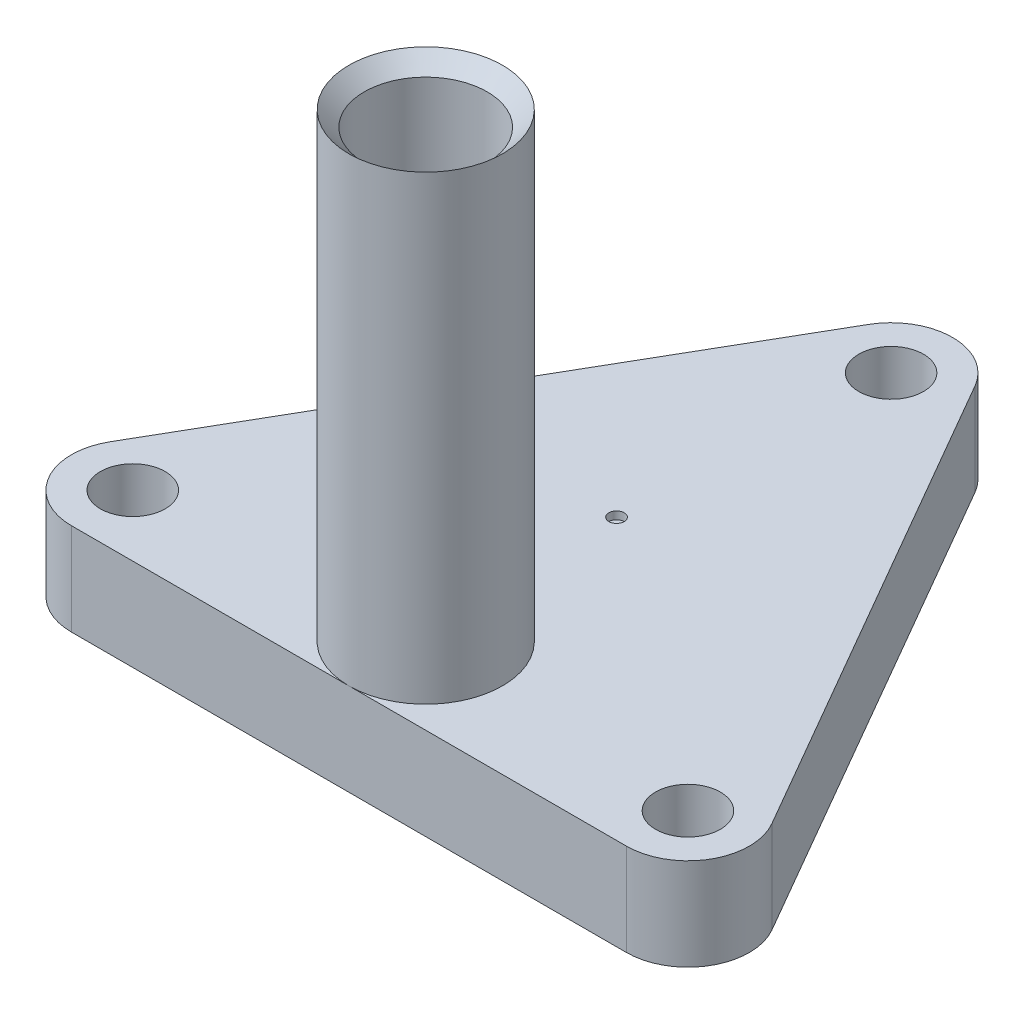
ISO-10303-21;
HEADER;
FILE_DESCRIPTION(('STEP AP214'),'2;1');
FILE_NAME('part.step','',(''),(''),'','','');
FILE_SCHEMA(('AUTOMOTIVE_DESIGN { 1 0 10303 214 1 1 1 1 }'));
ENDSEC;
DATA;
#1=APPLICATION_CONTEXT('core data for automotive mechanical design processes');
#2=APPLICATION_PROTOCOL_DEFINITION('international standard','automotive_design',2000,#1);
#3=PRODUCT_CONTEXT('',#1,'mechanical');
#4=PRODUCT('Part','Part','',(#3));
#5=PRODUCT_RELATED_PRODUCT_CATEGORY('part','',(#4));
#6=PRODUCT_DEFINITION_FORMATION('','',#4);
#7=PRODUCT_DEFINITION_CONTEXT('part definition',#1,'design');
#8=PRODUCT_DEFINITION('design','',#6,#7);
#9=PRODUCT_DEFINITION_SHAPE('','',#8);
#10=(LENGTH_UNIT() NAMED_UNIT(*) SI_UNIT(.MILLI.,.METRE.));
#11=(NAMED_UNIT(*) PLANE_ANGLE_UNIT() SI_UNIT($,.RADIAN.));
#12=(NAMED_UNIT(*) SI_UNIT($,.STERADIAN.) SOLID_ANGLE_UNIT());
#13=UNCERTAINTY_MEASURE_WITH_UNIT(LENGTH_MEASURE(1.E-05),#10,'distance_accuracy_value','');
#14=(GEOMETRIC_REPRESENTATION_CONTEXT(3) GLOBAL_UNCERTAINTY_ASSIGNED_CONTEXT((#13)) GLOBAL_UNIT_ASSIGNED_CONTEXT((#10,
#11,#12)) REPRESENTATION_CONTEXT('',''));
#15=CARTESIAN_POINT('',(0.,0.,0.));
#16=DIRECTION('',(0.,0.,1.));
#17=DIRECTION('',(1.,0.,0.));
#18=AXIS2_PLACEMENT_3D('',#15,#16,#17);
#19=CARTESIAN_POINT('',(9.0358983848623,3.,-2.));
#20=DIRECTION('',(0.,1.,0.));
#21=DIRECTION('',(0.,0.,1.));
#22=AXIS2_PLACEMENT_3D('',#19,#20,#21);
#23=PLANE('',#22);
#24=CARTESIAN_POINT('',(-0.400704282406141,3.,-9.11308369054479));
#25=DIRECTION('',(0.,1.,0.));
#26=DIRECTION('',(0.,0.,1.));
#27=AXIS2_PLACEMENT_3D('',#24,#25,#26);
#28=CIRCLE('',#27,0.250000000000119);
#29=CARTESIAN_POINT('',(-0.400704282406141,3.,-8.86308369054467));
#30=VERTEX_POINT('',#29);
#31=EDGE_CURVE('E172',#30,#30,#28,.T.);
#32=ORIENTED_EDGE('',*,*,#31,.F.);
#33=EDGE_LOOP('',(#32));
#34=FACE_BOUND('',#33,.T.);
#35=CARTESIAN_POINT('',(-9.03589838486223,3.,-2.));
#36=DIRECTION('',(0.,1.,0.));
#37=DIRECTION('',(0.,0.,1.));
#38=AXIS2_PLACEMENT_3D('',#35,#36,#37);
#39=CIRCLE('',#38,1.054);
#40=CARTESIAN_POINT('',(-9.03589838486223,3.,-0.945999999999999));
#41=VERTEX_POINT('',#40);
#42=EDGE_CURVE('E188',#41,#41,#39,.T.);
#43=ORIENTED_EDGE('',*,*,#42,.F.);
#44=EDGE_LOOP('',(#43));
#45=FACE_BOUND('',#44,.T.);
#46=DIRECTION('',(1.,0.,0.));
#47=VECTOR('',#46,1.);
#48=CARTESIAN_POINT('',(-9.03589838486223,3.,0.));
#49=LINE('',#48,#47);
#50=CARTESIAN_POINT('',(-9.03589838486223,3.,0.));
#51=VERTEX_POINT('',#50);
#52=CARTESIAN_POINT('',(0.,3.,0.));
#53=VERTEX_POINT('',#52);
#54=EDGE_CURVE('E198',#51,#53,#49,.T.);
#55=ORIENTED_EDGE('',*,*,#54,.T.);
#56=CARTESIAN_POINT('',(0.,3.,-2.5));
#57=DIRECTION('',(0.,1.,0.));
#58=DIRECTION('',(0.,0.,1.));
#59=AXIS2_PLACEMENT_3D('',#56,#57,#58);
#60=CIRCLE('',#59,2.5);
#61=EDGE_CURVE('E165',#53,#53,#60,.T.);
#62=ORIENTED_EDGE('',*,*,#61,.F.);
#63=CARTESIAN_POINT('',(9.03589838486229,3.,0.));
#64=VERTEX_POINT('',#63);
#65=EDGE_CURVE('E91',#53,#64,#49,.T.);
#66=ORIENTED_EDGE('',*,*,#65,.T.);
#67=CARTESIAN_POINT('',(9.0358983848623,3.,-2.));
#68=DIRECTION('',(0.,1.,0.));
#69=DIRECTION('',(0.,0.,1.));
#70=AXIS2_PLACEMENT_3D('',#67,#68,#69);
#71=CIRCLE('',#70,2.);
#72=CARTESIAN_POINT('',(10.7679491924312,3.,-2.99999999999998));
#73=VERTEX_POINT('',#72);
#74=EDGE_CURVE('E200',#64,#73,#71,.T.);
#75=ORIENTED_EDGE('',*,*,#74,.T.);
#76=DIRECTION('',(-0.499999999999991,0.,-0.866025403784444));
#77=VECTOR('',#76,1.);
#78=CARTESIAN_POINT('',(10.7679491924312,3.,-2.99999999999998));
#79=LINE('',#78,#77);
#80=CARTESIAN_POINT('',(1.73205080756907,3.,-18.6506350946111));
#81=VERTEX_POINT('',#80);
#82=EDGE_CURVE('E106',#73,#81,#79,.T.);
#83=ORIENTED_EDGE('',*,*,#82,.T.);
#84=CARTESIAN_POINT('',(1.90824453591173E-13,3.,-17.6506350946111));
#85=DIRECTION('',(0.,1.,0.));
#86=DIRECTION('',(0.,0.,1.));
#87=AXIS2_PLACEMENT_3D('',#84,#85,#86);
#88=CIRCLE('',#87,2.);
#89=CARTESIAN_POINT('',(-1.73205080756868,3.,-18.6506350946111));
#90=VERTEX_POINT('',#89);
#91=EDGE_CURVE('E100',#81,#90,#88,.T.);
#92=ORIENTED_EDGE('',*,*,#91,.T.);
#93=DIRECTION('',(-0.500000000000004,0.,0.866025403784436));
#94=VECTOR('',#93,1.);
#95=CARTESIAN_POINT('',(-1.73205080756869,3.,-18.6506350946111));
#96=LINE('',#95,#94);
#97=CARTESIAN_POINT('',(-10.7679491924311,3.,-3.00000000000001));
#98=VERTEX_POINT('',#97);
#99=EDGE_CURVE('E104',#90,#98,#96,.T.);
#100=ORIENTED_EDGE('',*,*,#99,.T.);
#101=CARTESIAN_POINT('',(-9.03589838486223,3.,-2.));
#102=DIRECTION('',(0.,1.,0.));
#103=DIRECTION('',(0.,0.,1.));
#104=AXIS2_PLACEMENT_3D('',#101,#102,#103);
#105=CIRCLE('',#104,2.);
#106=EDGE_CURVE('E52',#98,#51,#105,.T.);
#107=ORIENTED_EDGE('',*,*,#106,.T.);
#108=EDGE_LOOP('',(#55,#62,#66,#75,#83,#92,#100,#107));
#109=FACE_BOUND('',#108,.T.);
#110=CARTESIAN_POINT('',(1.90824453591173E-13,3.,-17.6506350946111));
#111=DIRECTION('',(0.,1.,0.));
#112=DIRECTION('',(0.,0.,1.));
#113=AXIS2_PLACEMENT_3D('',#110,#111,#112);
#114=CIRCLE('',#113,1.054);
#115=CARTESIAN_POINT('',(1.90824453591173E-13,3.,-16.5966350946111));
#116=VERTEX_POINT('',#115);
#117=EDGE_CURVE('E126',#116,#116,#114,.T.);
#118=ORIENTED_EDGE('',*,*,#117,.F.);
#119=EDGE_LOOP('',(#118));
#120=FACE_BOUND('',#119,.T.);
#121=CARTESIAN_POINT('',(9.0358983848623,3.,-2.));
#122=DIRECTION('',(0.,1.,0.));
#123=DIRECTION('',(0.,0.,1.));
#124=AXIS2_PLACEMENT_3D('',#121,#122,#123);
#125=CIRCLE('',#124,1.054);
#126=CARTESIAN_POINT('',(9.0358983848623,3.,-0.946));
#127=VERTEX_POINT('',#126);
#128=EDGE_CURVE('E182',#127,#127,#125,.T.);
#129=ORIENTED_EDGE('',*,*,#128,.F.);
#130=EDGE_LOOP('',(#129));
#131=FACE_BOUND('',#130,.T.);
#132=ADVANCED_FACE('F35',(#34,#45,#109,#120,#131),#23,.T.);
#133=CARTESIAN_POINT('',(9.0358983848623,0.,-2.));
#134=DIRECTION('',(0.,1.,0.));
#135=DIRECTION('',(0.,0.,1.));
#136=AXIS2_PLACEMENT_3D('',#133,#134,#135);
#137=PLANE('',#136);
#138=CARTESIAN_POINT('',(0.,0.,-2.5));
#139=DIRECTION('',(0.,1.,0.));
#140=DIRECTION('',(0.,0.,1.));
#141=AXIS2_PLACEMENT_3D('',#138,#139,#140);
#142=CIRCLE('',#141,0.8);
#143=CARTESIAN_POINT('',(0.,0.,-1.7));
#144=VERTEX_POINT('',#143);
#145=EDGE_CURVE('E177',#144,#144,#142,.T.);
#146=ORIENTED_EDGE('',*,*,#145,.T.);
#147=EDGE_LOOP('',(#146));
#148=FACE_BOUND('',#147,.T.);
#149=CARTESIAN_POINT('',(-9.03589838486223,0.,-2.));
#150=DIRECTION('',(0.,1.,0.));
#151=DIRECTION('',(0.,0.,1.));
#152=AXIS2_PLACEMENT_3D('',#149,#150,#151);
#153=CIRCLE('',#152,1.054);
#154=CARTESIAN_POINT('',(-9.03589838486223,0.,-0.945999999999999));
#155=VERTEX_POINT('',#154);
#156=EDGE_CURVE('E185',#155,#155,#153,.T.);
#157=ORIENTED_EDGE('',*,*,#156,.T.);
#158=EDGE_LOOP('',(#157));
#159=FACE_BOUND('',#158,.T.);
#160=DIRECTION('',(1.,0.,0.));
#161=VECTOR('',#160,1.);
#162=CARTESIAN_POINT('',(0.,0.,0.));
#163=LINE('',#162,#161);
#164=CARTESIAN_POINT('',(-9.03589838486223,0.,0.));
#165=VERTEX_POINT('',#164);
#166=CARTESIAN_POINT('',(9.03589838486229,0.,0.));
#167=VERTEX_POINT('',#166);
#168=EDGE_CURVE('E83',#165,#167,#163,.T.);
#169=ORIENTED_EDGE('',*,*,#168,.F.);
#170=CARTESIAN_POINT('',(-9.03589838486223,0.,-2.));
#171=DIRECTION('',(0.,1.,0.));
#172=DIRECTION('',(0.,0.,1.));
#173=AXIS2_PLACEMENT_3D('',#170,#171,#172);
#174=CIRCLE('',#173,2.);
#175=CARTESIAN_POINT('',(-10.7679491924311,0.,-3.00000000000001));
#176=VERTEX_POINT('',#175);
#177=EDGE_CURVE('E132',#176,#165,#174,.T.);
#178=ORIENTED_EDGE('',*,*,#177,.F.);
#179=DIRECTION('',(-0.500000000000004,0.,0.866025403784436));
#180=VECTOR('',#179,1.);
#181=CARTESIAN_POINT('',(-1.73205080756869,0.,-18.6506350946111));
#182=LINE('',#181,#180);
#183=CARTESIAN_POINT('',(-1.73205080756868,0.,-18.6506350946111));
#184=VERTEX_POINT('',#183);
#185=EDGE_CURVE('E76',#184,#176,#182,.T.);
#186=ORIENTED_EDGE('',*,*,#185,.F.);
#187=CARTESIAN_POINT('',(1.90824453591173E-13,0.,-17.6506350946111));
#188=DIRECTION('',(0.,1.,0.));
#189=DIRECTION('',(0.,0.,1.));
#190=AXIS2_PLACEMENT_3D('',#187,#188,#189);
#191=CIRCLE('',#190,2.);
#192=CARTESIAN_POINT('',(1.73205080756907,0.,-18.6506350946111));
#193=VERTEX_POINT('',#192);
#194=EDGE_CURVE('E114',#193,#184,#191,.T.);
#195=ORIENTED_EDGE('',*,*,#194,.F.);
#196=DIRECTION('',(-0.499999999999991,0.,-0.866025403784444));
#197=VECTOR('',#196,1.);
#198=CARTESIAN_POINT('',(10.7679491924312,0.,-2.99999999999998));
#199=LINE('',#198,#197);
#200=CARTESIAN_POINT('',(10.7679491924312,0.,-2.99999999999998));
#201=VERTEX_POINT('',#200);
#202=EDGE_CURVE('E128',#201,#193,#199,.T.);
#203=ORIENTED_EDGE('',*,*,#202,.F.);
#204=CARTESIAN_POINT('',(9.0358983848623,0.,-2.));
#205=DIRECTION('',(0.,1.,0.));
#206=DIRECTION('',(0.,0.,1.));
#207=AXIS2_PLACEMENT_3D('',#204,#205,#206);
#208=CIRCLE('',#207,2.);
#209=EDGE_CURVE('E125',#167,#201,#208,.T.);
#210=ORIENTED_EDGE('',*,*,#209,.F.);
#211=EDGE_LOOP('',(#169,#178,#186,#195,#203,#210));
#212=FACE_BOUND('',#211,.T.);
#213=CARTESIAN_POINT('',(1.90824453591173E-13,0.,-17.6506350946111));
#214=DIRECTION('',(0.,1.,0.));
#215=DIRECTION('',(0.,0.,1.));
#216=AXIS2_PLACEMENT_3D('',#213,#214,#215);
#217=CIRCLE('',#216,1.054);
#218=CARTESIAN_POINT('',(1.90824453591173E-13,0.,-16.5966350946111));
#219=VERTEX_POINT('',#218);
#220=EDGE_CURVE('E191',#219,#219,#217,.T.);
#221=ORIENTED_EDGE('',*,*,#220,.T.);
#222=EDGE_LOOP('',(#221));
#223=FACE_BOUND('',#222,.T.);
#224=CARTESIAN_POINT('',(9.0358983848623,0.,-2.));
#225=DIRECTION('',(0.,1.,0.));
#226=DIRECTION('',(0.,0.,1.));
#227=AXIS2_PLACEMENT_3D('',#224,#225,#226);
#228=CIRCLE('',#227,1.054);
#229=CARTESIAN_POINT('',(9.0358983848623,0.,-0.946));
#230=VERTEX_POINT('',#229);
#231=EDGE_CURVE('E181',#230,#230,#228,.T.);
#232=ORIENTED_EDGE('',*,*,#231,.T.);
#233=EDGE_LOOP('',(#232));
#234=FACE_BOUND('',#233,.T.);
#235=ADVANCED_FACE('F208',(#148,#159,#212,#223,#234),#137,.F.);
#236=CARTESIAN_POINT('',(0.,3.,0.));
#237=DIRECTION('',(0.,0.,-1.));
#238=DIRECTION('',(-1.,0.,0.));
#239=AXIS2_PLACEMENT_3D('',#236,#237,#238);
#240=PLANE('',#239);
#241=ORIENTED_EDGE('',*,*,#168,.T.);
#242=DIRECTION('',(0.,-1.,0.));
#243=VECTOR('',#242,1.);
#244=CARTESIAN_POINT('',(9.03589838486229,3.,0.));
#245=LINE('',#244,#243);
#246=EDGE_CURVE('E141',#64,#167,#245,.T.);
#247=ORIENTED_EDGE('',*,*,#246,.F.);
#248=ORIENTED_EDGE('',*,*,#65,.F.);
#249=ORIENTED_EDGE('',*,*,#54,.F.);
#250=DIRECTION('',(0.,-1.,0.));
#251=VECTOR('',#250,1.);
#252=CARTESIAN_POINT('',(-9.03589838486223,3.,0.));
#253=LINE('',#252,#251);
#254=EDGE_CURVE('E120',#51,#165,#253,.T.);
#255=ORIENTED_EDGE('',*,*,#254,.T.);
#256=EDGE_LOOP('',(#241,#247,#248,#249,#255));
#257=FACE_BOUND('',#256,.T.);
#258=ADVANCED_FACE('F214',(#257),#240,.F.);
#259=CARTESIAN_POINT('',(9.0358983848623,3.,-2.));
#260=DIRECTION('',(0.,-1.,0.));
#261=DIRECTION('',(0.,0.,-1.));
#262=AXIS2_PLACEMENT_3D('',#259,#260,#261);
#263=CYLINDRICAL_SURFACE('',#262,2.);
#264=ORIENTED_EDGE('',*,*,#209,.T.);
#265=DIRECTION('',(0.,-1.,0.));
#266=VECTOR('',#265,1.);
#267=CARTESIAN_POINT('',(10.7679491924312,3.,-2.99999999999998));
#268=LINE('',#267,#266);
#269=EDGE_CURVE('E138',#73,#201,#268,.T.);
#270=ORIENTED_EDGE('',*,*,#269,.F.);
#271=ORIENTED_EDGE('',*,*,#74,.F.);
#272=ORIENTED_EDGE('',*,*,#246,.T.);
#273=EDGE_LOOP('',(#264,#270,#271,#272));
#274=FACE_BOUND('',#273,.T.);
#275=ADVANCED_FACE('F204',(#274),#263,.T.);
#276=CARTESIAN_POINT('',(10.7679491924312,3.,-2.99999999999998));
#277=DIRECTION('',(-0.866025403784444,0.,0.499999999999991));
#278=DIRECTION('',(0.499999999999991,0.,0.866025403784444));
#279=AXIS2_PLACEMENT_3D('',#276,#277,#278);
#280=PLANE('',#279);
#281=ORIENTED_EDGE('',*,*,#202,.T.);
#282=DIRECTION('',(0.,-1.,0.));
#283=VECTOR('',#282,1.);
#284=CARTESIAN_POINT('',(1.73205080756907,3.,-18.6506350946111));
#285=LINE('',#284,#283);
#286=EDGE_CURVE('E115',#81,#193,#285,.T.);
#287=ORIENTED_EDGE('',*,*,#286,.F.);
#288=ORIENTED_EDGE('',*,*,#82,.F.);
#289=ORIENTED_EDGE('',*,*,#269,.T.);
#290=EDGE_LOOP('',(#281,#287,#288,#289));
#291=FACE_BOUND('',#290,.T.);
#292=ADVANCED_FACE('F207',(#291),#280,.F.);
#293=CARTESIAN_POINT('',(1.90824453591173E-13,3.,-17.6506350946111));
#294=DIRECTION('',(0.,-1.,0.));
#295=DIRECTION('',(0.,0.,-1.));
#296=AXIS2_PLACEMENT_3D('',#293,#294,#295);
#297=CYLINDRICAL_SURFACE('',#296,2.);
#298=ORIENTED_EDGE('',*,*,#194,.T.);
#299=DIRECTION('',(0.,-1.,0.));
#300=VECTOR('',#299,1.);
#301=CARTESIAN_POINT('',(-1.73205080756868,3.,-18.6506350946111));
#302=LINE('',#301,#300);
#303=EDGE_CURVE('E111',#90,#184,#302,.T.);
#304=ORIENTED_EDGE('',*,*,#303,.F.);
#305=ORIENTED_EDGE('',*,*,#91,.F.);
#306=ORIENTED_EDGE('',*,*,#286,.T.);
#307=EDGE_LOOP('',(#298,#304,#305,#306));
#308=FACE_BOUND('',#307,.T.);
#309=ADVANCED_FACE('F112',(#308),#297,.T.);
#310=CARTESIAN_POINT('',(-1.73205080756869,3.,-18.6506350946111));
#311=DIRECTION('',(0.866025403784436,0.,0.500000000000004));
#312=DIRECTION('',(0.500000000000004,0.,-0.866025403784436));
#313=AXIS2_PLACEMENT_3D('',#310,#311,#312);
#314=PLANE('',#313);
#315=ORIENTED_EDGE('',*,*,#185,.T.);
#316=DIRECTION('',(0.,-1.,0.));
#317=VECTOR('',#316,1.);
#318=CARTESIAN_POINT('',(-10.7679491924311,3.,-3.00000000000001));
#319=LINE('',#318,#317);
#320=EDGE_CURVE('E116',#98,#176,#319,.T.);
#321=ORIENTED_EDGE('',*,*,#320,.F.);
#322=ORIENTED_EDGE('',*,*,#99,.F.);
#323=ORIENTED_EDGE('',*,*,#303,.T.);
#324=EDGE_LOOP('',(#315,#321,#322,#323));
#325=FACE_BOUND('',#324,.T.);
#326=ADVANCED_FACE('F118',(#325),#314,.F.);
#327=CARTESIAN_POINT('',(-9.03589838486223,3.,-2.));
#328=DIRECTION('',(0.,-1.,0.));
#329=DIRECTION('',(0.,0.,-1.));
#330=AXIS2_PLACEMENT_3D('',#327,#328,#329);
#331=CYLINDRICAL_SURFACE('',#330,2.);
#332=ORIENTED_EDGE('',*,*,#177,.T.);
#333=ORIENTED_EDGE('',*,*,#254,.F.);
#334=ORIENTED_EDGE('',*,*,#106,.F.);
#335=ORIENTED_EDGE('',*,*,#320,.T.);
#336=EDGE_LOOP('',(#332,#333,#334,#335));
#337=FACE_BOUND('',#336,.T.);
#338=ADVANCED_FACE('F211',(#337),#331,.T.);
#339=CARTESIAN_POINT('',(1.90824453591173E-13,3.,-17.6506350946111));
#340=DIRECTION('',(0.,-1.,0.));
#341=DIRECTION('',(0.,0.,-1.));
#342=AXIS2_PLACEMENT_3D('',#339,#340,#341);
#343=CYLINDRICAL_SURFACE('',#342,1.054);
#344=ORIENTED_EDGE('',*,*,#117,.T.);
#345=EDGE_LOOP('',(#344));
#346=FACE_BOUND('',#345,.T.);
#347=ORIENTED_EDGE('',*,*,#220,.F.);
#348=EDGE_LOOP('',(#347));
#349=FACE_BOUND('',#348,.T.);
#350=ADVANCED_FACE('F239',(#346,#349),#343,.F.);
#351=CARTESIAN_POINT('',(-9.03589838486223,3.,-2.));
#352=DIRECTION('',(0.,-1.,0.));
#353=DIRECTION('',(0.,0.,-1.));
#354=AXIS2_PLACEMENT_3D('',#351,#352,#353);
#355=CYLINDRICAL_SURFACE('',#354,1.054);
#356=ORIENTED_EDGE('',*,*,#42,.T.);
#357=EDGE_LOOP('',(#356));
#358=FACE_BOUND('',#357,.T.);
#359=ORIENTED_EDGE('',*,*,#156,.F.);
#360=EDGE_LOOP('',(#359));
#361=FACE_BOUND('',#360,.T.);
#362=ADVANCED_FACE('F284',(#358,#361),#355,.F.);
#363=CARTESIAN_POINT('',(9.0358983848623,3.,-2.));
#364=DIRECTION('',(0.,-1.,0.));
#365=DIRECTION('',(0.,0.,-1.));
#366=AXIS2_PLACEMENT_3D('',#363,#364,#365);
#367=CYLINDRICAL_SURFACE('',#366,1.054);
#368=ORIENTED_EDGE('',*,*,#128,.T.);
#369=EDGE_LOOP('',(#368));
#370=FACE_BOUND('',#369,.T.);
#371=ORIENTED_EDGE('',*,*,#231,.F.);
#372=EDGE_LOOP('',(#371));
#373=FACE_BOUND('',#372,.T.);
#374=ADVANCED_FACE('F223',(#370,#373),#367,.F.);
#375=CARTESIAN_POINT('',(0.,0.,-2.5));
#376=DIRECTION('',(0.,1.,0.));
#377=DIRECTION('',(0.,0.,1.));
#378=AXIS2_PLACEMENT_3D('',#375,#376,#377);
#379=CYLINDRICAL_SURFACE('',#378,0.8);
#380=ORIENTED_EDGE('',*,*,#145,.F.);
#381=EDGE_LOOP('',(#380));
#382=FACE_BOUND('',#381,.T.);
#383=CARTESIAN_POINT('',(0.,3.,-2.5));
#384=DIRECTION('',(0.,1.,0.));
#385=DIRECTION('',(0.,0.,1.));
#386=AXIS2_PLACEMENT_3D('',#383,#384,#385);
#387=CIRCLE('',#386,0.8);
#388=CARTESIAN_POINT('',(0.,3.,-1.7));
#389=VERTEX_POINT('',#388);
#390=EDGE_CURVE('E163',#389,#389,#387,.F.);
#391=ORIENTED_EDGE('',*,*,#390,.F.);
#392=EDGE_LOOP('',(#391));
#393=FACE_BOUND('',#392,.T.);
#394=ADVANCED_FACE('F217',(#382,#393),#379,.F.);
#395=CARTESIAN_POINT('',(0.,18.,-2.5));
#396=DIRECTION('',(0.,-1.,0.));
#397=DIRECTION('',(0.,0.,-1.));
#398=AXIS2_PLACEMENT_3D('',#395,#396,#397);
#399=CYLINDRICAL_SURFACE('',#398,2.5);
#400=CARTESIAN_POINT('',(0.,18.,-2.5));
#401=DIRECTION('',(0.,1.,0.));
#402=DIRECTION('',(0.,0.,1.));
#403=AXIS2_PLACEMENT_3D('',#400,#401,#402);
#404=CIRCLE('',#403,2.5);
#405=CARTESIAN_POINT('',(0.,18.,0.));
#406=VERTEX_POINT('',#405);
#407=EDGE_CURVE('E169',#406,#406,#404,.T.);
#408=ORIENTED_EDGE('',*,*,#407,.F.);
#409=EDGE_LOOP('',(#408));
#410=FACE_BOUND('',#409,.T.);
#411=ORIENTED_EDGE('',*,*,#61,.T.);
#412=EDGE_LOOP('',(#411));
#413=FACE_BOUND('',#412,.T.);
#414=ADVANCED_FACE('F159',(#410,#413),#399,.T.);
#415=CARTESIAN_POINT('',(0.,3.,-2.5));
#416=DIRECTION('',(0.,1.,0.));
#417=DIRECTION('',(0.,0.,1.));
#418=AXIS2_PLACEMENT_3D('',#415,#416,#417);
#419=PLANE('',#418);
#420=CARTESIAN_POINT('',(0.,3.,-2.5));
#421=DIRECTION('',(0.,1.,0.));
#422=DIRECTION('',(0.,0.,1.));
#423=AXIS2_PLACEMENT_3D('',#420,#421,#422);
#424=CIRCLE('',#423,1.27205953146759);
#425=CARTESIAN_POINT('',(0.,3.,-1.22794046853241));
#426=VERTEX_POINT('',#425);
#427=EDGE_CURVE('E144',#426,#426,#424,.T.);
#428=ORIENTED_EDGE('',*,*,#427,.T.);
#429=EDGE_LOOP('',(#428));
#430=FACE_BOUND('',#429,.T.);
#431=ORIENTED_EDGE('',*,*,#390,.T.);
#432=EDGE_LOOP('',(#431));
#433=FACE_BOUND('',#432,.T.);
#434=ADVANCED_FACE('F156',(#430,#433),#419,.T.);
#435=CARTESIAN_POINT('',(0.,18.001,-2.5));
#436=DIRECTION('',(0.,-1.,0.));
#437=DIRECTION('',(0.,0.,-1.));
#438=AXIS2_PLACEMENT_3D('',#435,#436,#437);
#439=CYLINDRICAL_SURFACE('',#438,2.);
#440=CARTESIAN_POINT('',(0.,17.5,-2.5));
#441=DIRECTION('',(0.,1.,0.));
#442=DIRECTION('',(0.,0.,1.));
#443=AXIS2_PLACEMENT_3D('',#440,#441,#442);
#444=CIRCLE('',#443,2.);
#445=CARTESIAN_POINT('',(0.,17.5,-0.5));
#446=VERTEX_POINT('',#445);
#447=EDGE_CURVE('E11',#446,#446,#444,.T.);
#448=ORIENTED_EDGE('',*,*,#447,.T.);
#449=EDGE_LOOP('',(#448));
#450=FACE_BOUND('',#449,.T.);
#451=CARTESIAN_POINT('',(0.,4.99999999999999,-2.5));
#452=DIRECTION('',(0.,1.,0.));
#453=DIRECTION('',(0.,0.,1.));
#454=AXIS2_PLACEMENT_3D('',#451,#452,#453);
#455=CIRCLE('',#454,2.);
#456=CARTESIAN_POINT('',(0.,4.99999999999999,-0.5));
#457=VERTEX_POINT('',#456);
#458=EDGE_CURVE('E44',#457,#457,#455,.F.);
#459=ORIENTED_EDGE('',*,*,#458,.T.);
#460=EDGE_LOOP('',(#459));
#461=FACE_BOUND('',#460,.T.);
#462=ADVANCED_FACE('F149',(#450,#461),#439,.F.);
#463=CARTESIAN_POINT('',(0.,3.,-2.5));
#464=DIRECTION('',(0.,1.,0.));
#465=DIRECTION('',(0.,0.,1.));
#466=AXIS2_PLACEMENT_3D('',#463,#464,#465);
#467=CONICAL_SURFACE('',#466,1.27205953146759,0.34906585039887);
#468=ORIENTED_EDGE('',*,*,#458,.F.);
#469=EDGE_LOOP('',(#468));
#470=FACE_BOUND('',#469,.T.);
#471=ORIENTED_EDGE('',*,*,#427,.F.);
#472=EDGE_LOOP('',(#471));
#473=FACE_BOUND('',#472,.T.);
#474=ADVANCED_FACE('F151',(#470,#473),#467,.F.);
#475=CARTESIAN_POINT('',(0.,17.5,-2.5));
#476=DIRECTION('',(0.,1.,0.));
#477=DIRECTION('',(0.,0.,1.));
#478=AXIS2_PLACEMENT_3D('',#475,#476,#477);
#479=CONICAL_SURFACE('',#478,2.,0.78539816339745);
#480=ORIENTED_EDGE('',*,*,#407,.T.);
#481=EDGE_LOOP('',(#480));
#482=FACE_BOUND('',#481,.T.);
#483=ORIENTED_EDGE('',*,*,#447,.F.);
#484=EDGE_LOOP('',(#483));
#485=FACE_BOUND('',#484,.T.);
#486=ADVANCED_FACE('F37',(#482,#485),#479,.F.);
#487=CARTESIAN_POINT('',(-0.400704282406141,2.75,-9.11308369054479));
#488=DIRECTION('',(0.,1.,0.));
#489=DIRECTION('',(0.,0.,1.));
#490=AXIS2_PLACEMENT_3D('',#487,#488,#489);
#491=CYLINDRICAL_SURFACE('',#490,0.250000000000119);
#492=CARTESIAN_POINT('',(-0.400704282406141,2.75,-9.11308369054479));
#493=DIRECTION('',(0.,1.,0.));
#494=DIRECTION('',(0.,0.,1.));
#495=AXIS2_PLACEMENT_3D('',#492,#493,#494);
#496=CIRCLE('',#495,0.250000000000119);
#497=CARTESIAN_POINT('',(-0.400704282406141,2.75,-8.86308369054467));
#498=VERTEX_POINT('',#497);
#499=EDGE_CURVE('E166',#498,#498,#496,.T.);
#500=ORIENTED_EDGE('',*,*,#499,.F.);
#501=EDGE_LOOP('',(#500));
#502=FACE_BOUND('',#501,.T.);
#503=ORIENTED_EDGE('',*,*,#31,.T.);
#504=EDGE_LOOP('',(#503));
#505=FACE_BOUND('',#504,.T.);
#506=ADVANCED_FACE('F341',(#502,#505),#491,.F.);
#507=CARTESIAN_POINT('',(-0.400704282406141,2.75,-9.11308369054479));
#508=DIRECTION('',(0.,1.,0.));
#509=DIRECTION('',(0.,0.,1.));
#510=AXIS2_PLACEMENT_3D('',#507,#508,#509);
#511=PLANE('',#510);
#512=ORIENTED_EDGE('',*,*,#499,.T.);
#513=EDGE_LOOP('',(#512));
#514=FACE_BOUND('',#513,.T.);
#515=ADVANCED_FACE('F346',(#514),#511,.T.);
#516=CLOSED_SHELL('',(#132,#235,#258,#275,#292,#309,#326,#338,#350,#362,#374,#394,#414,#434,
#462,#474,#486,#506,#515));
#517=MANIFOLD_SOLID_BREP('B2',#516);
#518=ADVANCED_BREP_SHAPE_REPRESENTATION('',(#18,#517),#14);
#519=SHAPE_DEFINITION_REPRESENTATION(#9,#518);
ENDSEC;
END-ISO-10303-21;
